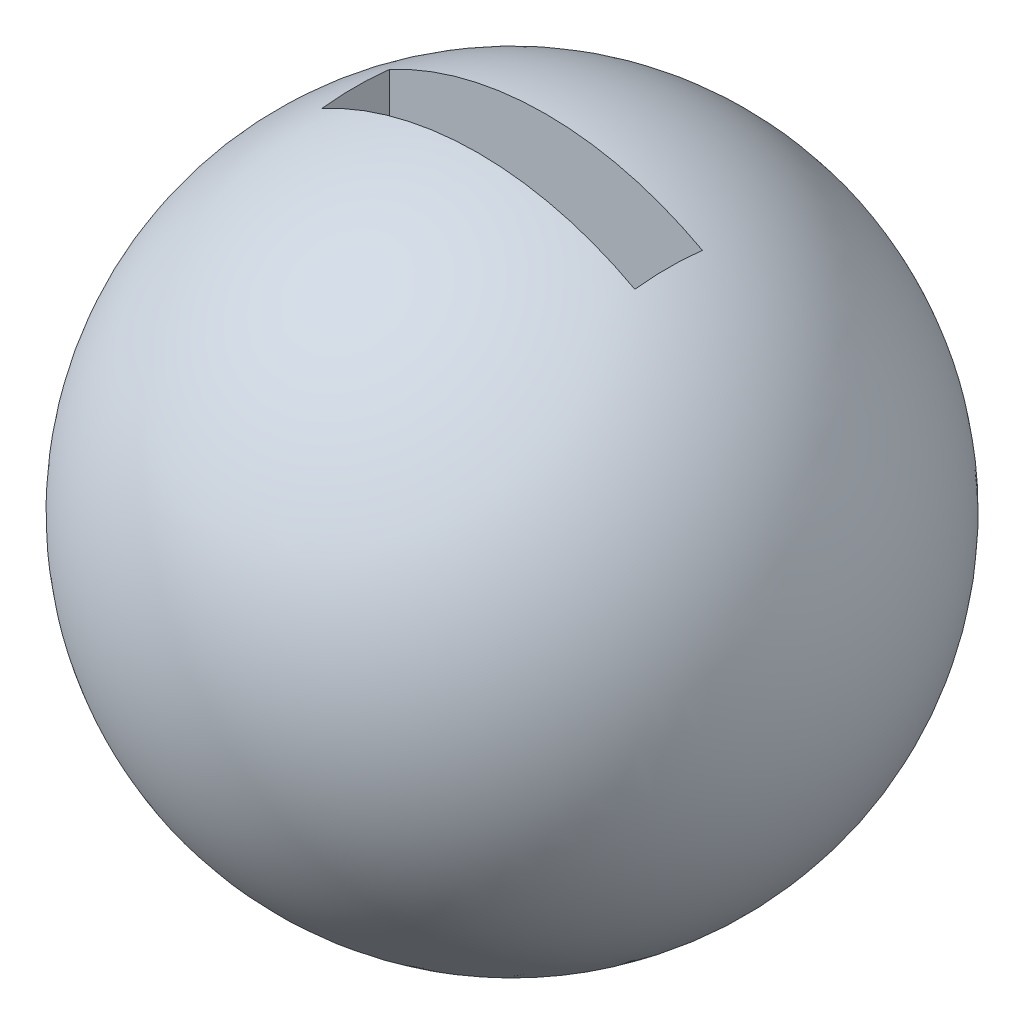
ISO-10303-21;
HEADER;
FILE_DESCRIPTION(('STEP AP214'),'2;1');
FILE_NAME('part.step','',(''),(''),'','','');
FILE_SCHEMA(('AUTOMOTIVE_DESIGN { 1 0 10303 214 1 1 1 1 }'));
ENDSEC;
DATA;
#1=APPLICATION_CONTEXT('core data for automotive mechanical design processes');
#2=APPLICATION_PROTOCOL_DEFINITION('international standard','automotive_design',2000,#1);
#3=PRODUCT_CONTEXT('',#1,'mechanical');
#4=PRODUCT('Part','Part','',(#3));
#5=PRODUCT_RELATED_PRODUCT_CATEGORY('part','',(#4));
#6=PRODUCT_DEFINITION_FORMATION('','',#4);
#7=PRODUCT_DEFINITION_CONTEXT('part definition',#1,'design');
#8=PRODUCT_DEFINITION('design','',#6,#7);
#9=PRODUCT_DEFINITION_SHAPE('','',#8);
#10=(LENGTH_UNIT() NAMED_UNIT(*) SI_UNIT(.MILLI.,.METRE.));
#11=(NAMED_UNIT(*) PLANE_ANGLE_UNIT() SI_UNIT($,.RADIAN.));
#12=(NAMED_UNIT(*) SI_UNIT($,.STERADIAN.) SOLID_ANGLE_UNIT());
#13=UNCERTAINTY_MEASURE_WITH_UNIT(LENGTH_MEASURE(1.E-05),#10,'distance_accuracy_value','');
#14=(GEOMETRIC_REPRESENTATION_CONTEXT(3) GLOBAL_UNCERTAINTY_ASSIGNED_CONTEXT((#13)) GLOBAL_UNIT_ASSIGNED_CONTEXT((#10,
#11,#12)) REPRESENTATION_CONTEXT('',''));
#15=CARTESIAN_POINT('',(0.,0.,0.));
#16=DIRECTION('',(0.,0.,1.));
#17=DIRECTION('',(1.,0.,0.));
#18=AXIS2_PLACEMENT_3D('',#15,#16,#17);
#19=CARTESIAN_POINT('',(0.,0.,0.));
#20=DIRECTION('',(0.,0.,1.));
#21=DIRECTION('',(-1.,0.,0.));
#22=AXIS2_PLACEMENT_3D('',#19,#20,#21);
#23=SPHERICAL_SURFACE('',#22,10.7354552767923);
#24=CARTESIAN_POINT('',(0.,-8.69446796595597,0.));
#25=DIRECTION('',(0.,1.,0.));
#26=DIRECTION('',(0.,0.,1.));
#27=AXIS2_PLACEMENT_3D('',#24,#25,#26);
#28=CIRCLE('',#27,6.29731901597596);
#29=CARTESIAN_POINT('',(0.,-8.69446796595597,6.29731901597596));
#30=VERTEX_POINT('',#29);
#31=EDGE_CURVE('E13',#30,#30,#28,.F.);
#32=ORIENTED_EDGE('',*,*,#31,.F.);
#33=EDGE_LOOP('',(#32));
#34=FACE_BOUND('',#33,.T.);
#35=CARTESIAN_POINT('',(0.,0.,1.1));
#36=DIRECTION('',(0.,0.,-1.));
#37=DIRECTION('',(-1.,0.,0.));
#38=AXIS2_PLACEMENT_3D('',#35,#36,#37);
#39=CIRCLE('',#38,10.6789512593703);
#40=CARTESIAN_POINT('',(-5.1,9.38243038876426,1.1));
#41=VERTEX_POINT('',#40);
#42=CARTESIAN_POINT('',(5.1,9.38243038876426,1.1));
#43=VERTEX_POINT('',#42);
#44=EDGE_CURVE('E104',#41,#43,#39,.T.);
#45=ORIENTED_EDGE('',*,*,#44,.F.);
#46=CARTESIAN_POINT('',(-5.1,0.,0.));
#47=DIRECTION('',(1.,0.,0.));
#48=DIRECTION('',(0.,0.,-1.));
#49=AXIS2_PLACEMENT_3D('',#46,#47,#48);
#50=CIRCLE('',#49,9.446692542896);
#51=CARTESIAN_POINT('',(-5.1,9.38243038876426,-1.1));
#52=VERTEX_POINT('',#51);
#53=EDGE_CURVE('E91',#52,#41,#50,.T.);
#54=ORIENTED_EDGE('',*,*,#53,.F.);
#55=CARTESIAN_POINT('',(0.,0.,-1.1));
#56=DIRECTION('',(0.,0.,1.));
#57=DIRECTION('',(1.,0.,0.));
#58=AXIS2_PLACEMENT_3D('',#55,#56,#57);
#59=CIRCLE('',#58,10.6789512593703);
#60=CARTESIAN_POINT('',(5.1,9.38243038876425,-1.1));
#61=VERTEX_POINT('',#60);
#62=EDGE_CURVE('E54',#61,#52,#59,.T.);
#63=ORIENTED_EDGE('',*,*,#62,.F.);
#64=CARTESIAN_POINT('',(5.1,0.,0.));
#65=DIRECTION('',(-1.,0.,0.));
#66=DIRECTION('',(0.,0.,1.));
#67=AXIS2_PLACEMENT_3D('',#64,#65,#66);
#68=CIRCLE('',#67,9.446692542896);
#69=EDGE_CURVE('E61',#43,#61,#68,.T.);
#70=ORIENTED_EDGE('',*,*,#69,.F.);
#71=EDGE_LOOP('',(#45,#54,#63,#70));
#72=FACE_BOUND('',#71,.T.);
#73=ADVANCED_FACE('F47',(#34,#72),#23,.T.);
#74=CARTESIAN_POINT('',(-19.896338613728,-8.69446796595597,-8.5));
#75=DIRECTION('',(0.,1.,0.));
#76=DIRECTION('',(0.,0.,1.));
#77=AXIS2_PLACEMENT_3D('',#74,#75,#76);
#78=PLANE('',#77);
#79=ORIENTED_EDGE('',*,*,#31,.T.);
#80=EDGE_LOOP('',(#79));
#81=FACE_BOUND('',#80,.T.);
#82=ADVANCED_FACE('F134',(#81),#78,.F.);
#83=CARTESIAN_POINT('',(-5.1,10.7364552767923,1.1));
#84=DIRECTION('',(1.,0.,0.));
#85=DIRECTION('',(0.,0.,-1.));
#86=AXIS2_PLACEMENT_3D('',#83,#84,#85);
#87=PLANE('',#86);
#88=ORIENTED_EDGE('',*,*,#53,.T.);
#89=DIRECTION('',(0.,-1.,0.));
#90=VECTOR('',#89,1.);
#91=CARTESIAN_POINT('',(-5.1,10.7364552767923,1.1));
#92=LINE('',#91,#90);
#93=CARTESIAN_POINT('',(-5.1,0.,1.1));
#94=VERTEX_POINT('',#93);
#95=EDGE_CURVE('E69',#41,#94,#92,.T.);
#96=ORIENTED_EDGE('',*,*,#95,.T.);
#97=DIRECTION('',(0.,0.,1.));
#98=VECTOR('',#97,1.);
#99=CARTESIAN_POINT('',(-5.1,0.,1.1));
#100=LINE('',#99,#98);
#101=CARTESIAN_POINT('',(-5.1,0.,-1.1));
#102=VERTEX_POINT('',#101);
#103=EDGE_CURVE('E94',#102,#94,#100,.T.);
#104=ORIENTED_EDGE('',*,*,#103,.F.);
#105=DIRECTION('',(0.,-1.,0.));
#106=VECTOR('',#105,1.);
#107=CARTESIAN_POINT('',(-5.1,10.7364552767923,-1.1));
#108=LINE('',#107,#106);
#109=EDGE_CURVE('E87',#52,#102,#108,.T.);
#110=ORIENTED_EDGE('',*,*,#109,.F.);
#111=EDGE_LOOP('',(#88,#96,#104,#110));
#112=FACE_BOUND('',#111,.T.);
#113=ADVANCED_FACE('F89',(#112),#87,.T.);
#114=CARTESIAN_POINT('',(5.1,10.7364552767923,1.1));
#115=DIRECTION('',(0.,0.,-1.));
#116=DIRECTION('',(-1.,0.,0.));
#117=AXIS2_PLACEMENT_3D('',#114,#115,#116);
#118=PLANE('',#117);
#119=ORIENTED_EDGE('',*,*,#44,.T.);
#120=DIRECTION('',(0.,-1.,0.));
#121=VECTOR('',#120,1.);
#122=CARTESIAN_POINT('',(5.1,10.7364552767923,1.1));
#123=LINE('',#122,#121);
#124=CARTESIAN_POINT('',(5.1,0.,1.1));
#125=VERTEX_POINT('',#124);
#126=EDGE_CURVE('E118',#43,#125,#123,.T.);
#127=ORIENTED_EDGE('',*,*,#126,.T.);
#128=DIRECTION('',(1.,0.,0.));
#129=VECTOR('',#128,1.);
#130=CARTESIAN_POINT('',(5.1,0.,1.1));
#131=LINE('',#130,#129);
#132=EDGE_CURVE('E106',#94,#125,#131,.T.);
#133=ORIENTED_EDGE('',*,*,#132,.F.);
#134=ORIENTED_EDGE('',*,*,#95,.F.);
#135=EDGE_LOOP('',(#119,#127,#133,#134));
#136=FACE_BOUND('',#135,.T.);
#137=ADVANCED_FACE('F120',(#136),#118,.T.);
#138=CARTESIAN_POINT('',(5.1,10.7364552767923,1.1));
#139=DIRECTION('',(-1.,0.,0.));
#140=DIRECTION('',(0.,0.,1.));
#141=AXIS2_PLACEMENT_3D('',#138,#139,#140);
#142=PLANE('',#141);
#143=ORIENTED_EDGE('',*,*,#69,.T.);
#144=DIRECTION('',(0.,-1.,0.));
#145=VECTOR('',#144,1.);
#146=CARTESIAN_POINT('',(5.1,10.7364552767923,-1.1));
#147=LINE('',#146,#145);
#148=CARTESIAN_POINT('',(5.1,0.,-1.1));
#149=VERTEX_POINT('',#148);
#150=EDGE_CURVE('E98',#61,#149,#147,.T.);
#151=ORIENTED_EDGE('',*,*,#150,.T.);
#152=DIRECTION('',(0.,0.,-1.));
#153=VECTOR('',#152,1.);
#154=CARTESIAN_POINT('',(5.1,0.,1.1));
#155=LINE('',#154,#153);
#156=EDGE_CURVE('E113',#125,#149,#155,.T.);
#157=ORIENTED_EDGE('',*,*,#156,.F.);
#158=ORIENTED_EDGE('',*,*,#126,.F.);
#159=EDGE_LOOP('',(#143,#151,#157,#158));
#160=FACE_BOUND('',#159,.T.);
#161=ADVANCED_FACE('F124',(#160),#142,.T.);
#162=CARTESIAN_POINT('',(5.1,10.7364552767923,-1.1));
#163=DIRECTION('',(0.,0.,1.));
#164=DIRECTION('',(1.,0.,0.));
#165=AXIS2_PLACEMENT_3D('',#162,#163,#164);
#166=PLANE('',#165);
#167=ORIENTED_EDGE('',*,*,#62,.T.);
#168=ORIENTED_EDGE('',*,*,#109,.T.);
#169=DIRECTION('',(-1.,0.,0.));
#170=VECTOR('',#169,1.);
#171=CARTESIAN_POINT('',(5.1,0.,-1.1));
#172=LINE('',#171,#170);
#173=EDGE_CURVE('E99',#149,#102,#172,.T.);
#174=ORIENTED_EDGE('',*,*,#173,.F.);
#175=ORIENTED_EDGE('',*,*,#150,.F.);
#176=EDGE_LOOP('',(#167,#168,#174,#175));
#177=FACE_BOUND('',#176,.T.);
#178=ADVANCED_FACE('F102',(#177),#166,.T.);
#179=CARTESIAN_POINT('',(0.,0.,0.));
#180=DIRECTION('',(0.,1.,0.));
#181=DIRECTION('',(0.,0.,1.));
#182=AXIS2_PLACEMENT_3D('',#179,#180,#181);
#183=PLANE('',#182);
#184=ORIENTED_EDGE('',*,*,#103,.T.);
#185=ORIENTED_EDGE('',*,*,#132,.T.);
#186=ORIENTED_EDGE('',*,*,#156,.T.);
#187=ORIENTED_EDGE('',*,*,#173,.T.);
#188=EDGE_LOOP('',(#184,#185,#186,#187));
#189=FACE_BOUND('',#188,.T.);
#190=ADVANCED_FACE('F123',(#189),#183,.T.);
#191=CLOSED_SHELL('',(#73,#82,#113,#137,#161,#178,#190));
#192=MANIFOLD_SOLID_BREP('B2',#191);
#193=ADVANCED_BREP_SHAPE_REPRESENTATION('',(#18,#192),#14);
#194=SHAPE_DEFINITION_REPRESENTATION(#9,#193);
ENDSEC;
END-ISO-10303-21;
